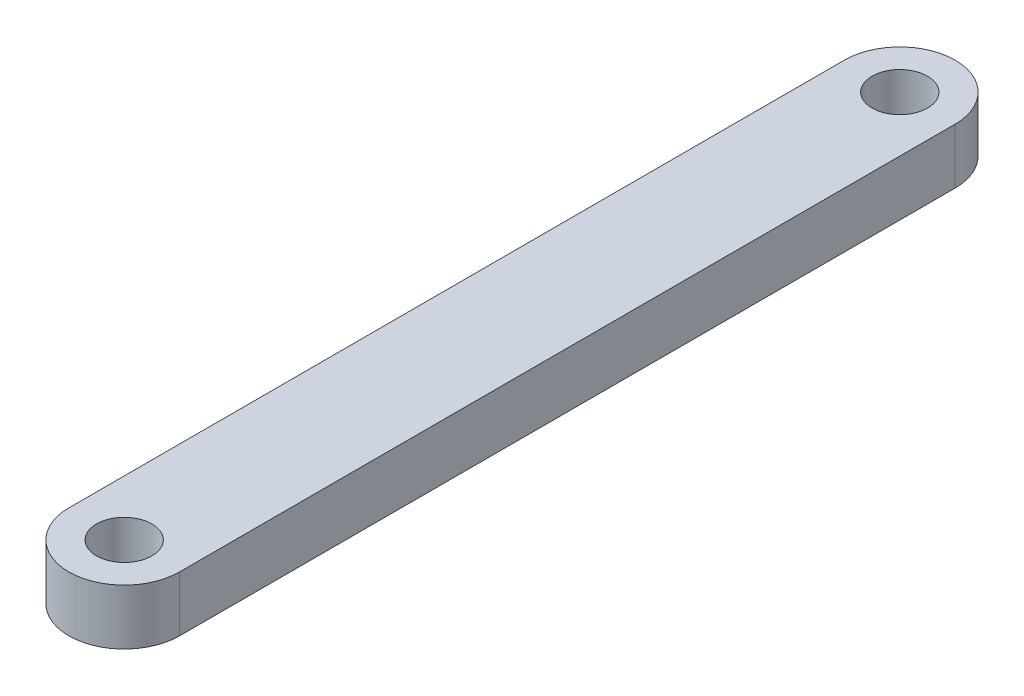
ISO-10303-21;
HEADER;
FILE_DESCRIPTION(('STEP AP214'),'2;1');
FILE_NAME('part.step','',(''),(''),'','','');
FILE_SCHEMA(('AUTOMOTIVE_DESIGN { 1 0 10303 214 1 1 1 1 }'));
ENDSEC;
DATA;
#1=APPLICATION_CONTEXT('core data for automotive mechanical design processes');
#2=APPLICATION_PROTOCOL_DEFINITION('international standard','automotive_design',2000,#1);
#3=PRODUCT_CONTEXT('',#1,'mechanical');
#4=PRODUCT('Part','Part','',(#3));
#5=PRODUCT_RELATED_PRODUCT_CATEGORY('part','',(#4));
#6=PRODUCT_DEFINITION_FORMATION('','',#4);
#7=PRODUCT_DEFINITION_CONTEXT('part definition',#1,'design');
#8=PRODUCT_DEFINITION('design','',#6,#7);
#9=PRODUCT_DEFINITION_SHAPE('','',#8);
#10=(LENGTH_UNIT() NAMED_UNIT(*) SI_UNIT(.MILLI.,.METRE.));
#11=(NAMED_UNIT(*) PLANE_ANGLE_UNIT() SI_UNIT($,.RADIAN.));
#12=(NAMED_UNIT(*) SI_UNIT($,.STERADIAN.) SOLID_ANGLE_UNIT());
#13=UNCERTAINTY_MEASURE_WITH_UNIT(LENGTH_MEASURE(1.E-05),#10,'distance_accuracy_value','');
#14=(GEOMETRIC_REPRESENTATION_CONTEXT(3) GLOBAL_UNCERTAINTY_ASSIGNED_CONTEXT((#13)) GLOBAL_UNIT_ASSIGNED_CONTEXT((#10,
#11,#12)) REPRESENTATION_CONTEXT('',''));
#15=CARTESIAN_POINT('',(0.,0.,0.));
#16=DIRECTION('',(0.,0.,1.));
#17=DIRECTION('',(1.,0.,0.));
#18=AXIS2_PLACEMENT_3D('',#15,#16,#17);
#19=CARTESIAN_POINT('',(0.,5.,-70.));
#20=DIRECTION('',(0.,1.,0.));
#21=DIRECTION('',(0.,0.,1.));
#22=AXIS2_PLACEMENT_3D('',#19,#20,#21);
#23=PLANE('',#22);
#24=CARTESIAN_POINT('',(0.,5.,0.));
#25=DIRECTION('',(0.,1.,0.));
#26=DIRECTION('',(0.,0.,1.));
#27=AXIS2_PLACEMENT_3D('',#24,#25,#26);
#28=CIRCLE('',#27,2.5);
#29=CARTESIAN_POINT('',(0.,5.,2.5));
#30=VERTEX_POINT('',#29);
#31=EDGE_CURVE('E103',#30,#30,#28,.T.);
#32=ORIENTED_EDGE('',*,*,#31,.F.);
#33=EDGE_LOOP('',(#32));
#34=FACE_BOUND('',#33,.T.);
#35=CARTESIAN_POINT('',(0.,5.,-70.));
#36=DIRECTION('',(0.,1.,0.));
#37=DIRECTION('',(0.,0.,1.));
#38=AXIS2_PLACEMENT_3D('',#35,#36,#37);
#39=CIRCLE('',#38,5.);
#40=CARTESIAN_POINT('',(5.,5.,-70.));
#41=VERTEX_POINT('',#40);
#42=CARTESIAN_POINT('',(-5.,5.,-70.));
#43=VERTEX_POINT('',#42);
#44=EDGE_CURVE('E88',#41,#43,#39,.T.);
#45=ORIENTED_EDGE('',*,*,#44,.T.);
#46=DIRECTION('',(0.,0.,1.));
#47=VECTOR('',#46,1.);
#48=CARTESIAN_POINT('',(-5.,5.,-70.));
#49=LINE('',#48,#47);
#50=CARTESIAN_POINT('',(-5.,5.,0.));
#51=VERTEX_POINT('',#50);
#52=EDGE_CURVE('E83',#43,#51,#49,.T.);
#53=ORIENTED_EDGE('',*,*,#52,.T.);
#54=CARTESIAN_POINT('',(0.,5.,0.));
#55=DIRECTION('',(0.,1.,0.));
#56=DIRECTION('',(0.,0.,1.));
#57=AXIS2_PLACEMENT_3D('',#54,#55,#56);
#58=CIRCLE('',#57,5.);
#59=CARTESIAN_POINT('',(5.,5.,0.));
#60=VERTEX_POINT('',#59);
#61=EDGE_CURVE('E86',#51,#60,#58,.T.);
#62=ORIENTED_EDGE('',*,*,#61,.T.);
#63=DIRECTION('',(0.,0.,-1.));
#64=VECTOR('',#63,1.);
#65=CARTESIAN_POINT('',(5.,5.,-70.));
#66=LINE('',#65,#64);
#67=EDGE_CURVE('E53',#60,#41,#66,.T.);
#68=ORIENTED_EDGE('',*,*,#67,.T.);
#69=EDGE_LOOP('',(#45,#53,#62,#68));
#70=FACE_BOUND('',#69,.T.);
#71=CARTESIAN_POINT('',(0.,5.,-70.));
#72=DIRECTION('',(0.,1.,0.));
#73=DIRECTION('',(0.,0.,1.));
#74=AXIS2_PLACEMENT_3D('',#71,#72,#73);
#75=CIRCLE('',#74,2.5);
#76=CARTESIAN_POINT('',(0.,5.,-67.5));
#77=VERTEX_POINT('',#76);
#78=EDGE_CURVE('E118',#77,#77,#75,.T.);
#79=ORIENTED_EDGE('',*,*,#78,.F.);
#80=EDGE_LOOP('',(#79));
#81=FACE_BOUND('',#80,.T.);
#82=ADVANCED_FACE('F36',(#34,#70,#81),#23,.T.);
#83=CARTESIAN_POINT('',(0.,0.,-70.));
#84=DIRECTION('',(0.,1.,0.));
#85=DIRECTION('',(0.,0.,1.));
#86=AXIS2_PLACEMENT_3D('',#83,#84,#85);
#87=PLANE('',#86);
#88=CARTESIAN_POINT('',(0.,0.,-70.));
#89=DIRECTION('',(0.,1.,0.));
#90=DIRECTION('',(0.,0.,1.));
#91=AXIS2_PLACEMENT_3D('',#88,#89,#90);
#92=CIRCLE('',#91,5.);
#93=CARTESIAN_POINT('',(5.,0.,-70.));
#94=VERTEX_POINT('',#93);
#95=CARTESIAN_POINT('',(-5.,0.,-70.));
#96=VERTEX_POINT('',#95);
#97=EDGE_CURVE('E100',#94,#96,#92,.T.);
#98=ORIENTED_EDGE('',*,*,#97,.F.);
#99=DIRECTION('',(0.,0.,-1.));
#100=VECTOR('',#99,1.);
#101=CARTESIAN_POINT('',(5.,0.,-70.));
#102=LINE('',#101,#100);
#103=CARTESIAN_POINT('',(5.,0.,0.));
#104=VERTEX_POINT('',#103);
#105=EDGE_CURVE('E76',#104,#94,#102,.T.);
#106=ORIENTED_EDGE('',*,*,#105,.F.);
#107=CARTESIAN_POINT('',(0.,0.,0.));
#108=DIRECTION('',(0.,1.,0.));
#109=DIRECTION('',(0.,0.,1.));
#110=AXIS2_PLACEMENT_3D('',#107,#108,#109);
#111=CIRCLE('',#110,5.);
#112=CARTESIAN_POINT('',(-5.,0.,0.));
#113=VERTEX_POINT('',#112);
#114=EDGE_CURVE('E70',#113,#104,#111,.T.);
#115=ORIENTED_EDGE('',*,*,#114,.F.);
#116=DIRECTION('',(0.,0.,1.));
#117=VECTOR('',#116,1.);
#118=CARTESIAN_POINT('',(-5.,0.,-70.));
#119=LINE('',#118,#117);
#120=EDGE_CURVE('E92',#96,#113,#119,.T.);
#121=ORIENTED_EDGE('',*,*,#120,.F.);
#122=EDGE_LOOP('',(#98,#106,#115,#121));
#123=FACE_BOUND('',#122,.T.);
#124=CARTESIAN_POINT('',(0.,0.,0.));
#125=DIRECTION('',(0.,1.,0.));
#126=DIRECTION('',(0.,0.,1.));
#127=AXIS2_PLACEMENT_3D('',#124,#125,#126);
#128=CIRCLE('',#127,2.5);
#129=CARTESIAN_POINT('',(0.,0.,2.5));
#130=VERTEX_POINT('',#129);
#131=EDGE_CURVE('E115',#130,#130,#128,.T.);
#132=ORIENTED_EDGE('',*,*,#131,.T.);
#133=EDGE_LOOP('',(#132));
#134=FACE_BOUND('',#133,.T.);
#135=CARTESIAN_POINT('',(0.,0.,-70.));
#136=DIRECTION('',(0.,1.,0.));
#137=DIRECTION('',(0.,0.,1.));
#138=AXIS2_PLACEMENT_3D('',#135,#136,#137);
#139=CIRCLE('',#138,2.5);
#140=CARTESIAN_POINT('',(0.,0.,-67.5));
#141=VERTEX_POINT('',#140);
#142=EDGE_CURVE('E121',#141,#141,#139,.T.);
#143=ORIENTED_EDGE('',*,*,#142,.T.);
#144=EDGE_LOOP('',(#143));
#145=FACE_BOUND('',#144,.T.);
#146=ADVANCED_FACE('F111',(#123,#134,#145),#87,.F.);
#147=CARTESIAN_POINT('',(0.,5.,-70.));
#148=DIRECTION('',(0.,-1.,0.));
#149=DIRECTION('',(0.,0.,-1.));
#150=AXIS2_PLACEMENT_3D('',#147,#148,#149);
#151=CYLINDRICAL_SURFACE('',#150,5.);
#152=ORIENTED_EDGE('',*,*,#97,.T.);
#153=DIRECTION('',(0.,-1.,0.));
#154=VECTOR('',#153,1.);
#155=CARTESIAN_POINT('',(-5.,5.,-70.));
#156=LINE('',#155,#154);
#157=EDGE_CURVE('E11',#43,#96,#156,.T.);
#158=ORIENTED_EDGE('',*,*,#157,.F.);
#159=ORIENTED_EDGE('',*,*,#44,.F.);
#160=DIRECTION('',(0.,-1.,0.));
#161=VECTOR('',#160,1.);
#162=CARTESIAN_POINT('',(5.,5.,-70.));
#163=LINE('',#162,#161);
#164=EDGE_CURVE('E96',#41,#94,#163,.T.);
#165=ORIENTED_EDGE('',*,*,#164,.T.);
#166=EDGE_LOOP('',(#152,#158,#159,#165));
#167=FACE_BOUND('',#166,.T.);
#168=ADVANCED_FACE('F38',(#167),#151,.T.);
#169=CARTESIAN_POINT('',(-5.,5.,-70.));
#170=DIRECTION('',(1.,0.,0.));
#171=DIRECTION('',(0.,0.,-1.));
#172=AXIS2_PLACEMENT_3D('',#169,#170,#171);
#173=PLANE('',#172);
#174=ORIENTED_EDGE('',*,*,#120,.T.);
#175=DIRECTION('',(0.,-1.,0.));
#176=VECTOR('',#175,1.);
#177=CARTESIAN_POINT('',(-5.,5.,0.));
#178=LINE('',#177,#176);
#179=EDGE_CURVE('E45',#51,#113,#178,.T.);
#180=ORIENTED_EDGE('',*,*,#179,.F.);
#181=ORIENTED_EDGE('',*,*,#52,.F.);
#182=ORIENTED_EDGE('',*,*,#157,.T.);
#183=EDGE_LOOP('',(#174,#180,#181,#182));
#184=FACE_BOUND('',#183,.T.);
#185=ADVANCED_FACE('F91',(#184),#173,.F.);
#186=CARTESIAN_POINT('',(0.,5.,0.));
#187=DIRECTION('',(0.,-1.,0.));
#188=DIRECTION('',(0.,0.,-1.));
#189=AXIS2_PLACEMENT_3D('',#186,#187,#188);
#190=CYLINDRICAL_SURFACE('',#189,5.);
#191=ORIENTED_EDGE('',*,*,#114,.T.);
#192=DIRECTION('',(0.,-1.,0.));
#193=VECTOR('',#192,1.);
#194=CARTESIAN_POINT('',(5.,5.,0.));
#195=LINE('',#194,#193);
#196=EDGE_CURVE('E93',#60,#104,#195,.T.);
#197=ORIENTED_EDGE('',*,*,#196,.F.);
#198=ORIENTED_EDGE('',*,*,#61,.F.);
#199=ORIENTED_EDGE('',*,*,#179,.T.);
#200=EDGE_LOOP('',(#191,#197,#198,#199));
#201=FACE_BOUND('',#200,.T.);
#202=ADVANCED_FACE('F94',(#201),#190,.T.);
#203=CARTESIAN_POINT('',(5.,5.,-70.));
#204=DIRECTION('',(-1.,0.,0.));
#205=DIRECTION('',(0.,0.,1.));
#206=AXIS2_PLACEMENT_3D('',#203,#204,#205);
#207=PLANE('',#206);
#208=ORIENTED_EDGE('',*,*,#105,.T.);
#209=ORIENTED_EDGE('',*,*,#164,.F.);
#210=ORIENTED_EDGE('',*,*,#67,.F.);
#211=ORIENTED_EDGE('',*,*,#196,.T.);
#212=EDGE_LOOP('',(#208,#209,#210,#211));
#213=FACE_BOUND('',#212,.T.);
#214=ADVANCED_FACE('F108',(#213),#207,.F.);
#215=CARTESIAN_POINT('',(0.,5.,0.));
#216=DIRECTION('',(0.,-1.,0.));
#217=DIRECTION('',(0.,0.,-1.));
#218=AXIS2_PLACEMENT_3D('',#215,#216,#217);
#219=CYLINDRICAL_SURFACE('',#218,2.5);
#220=ORIENTED_EDGE('',*,*,#31,.T.);
#221=EDGE_LOOP('',(#220));
#222=FACE_BOUND('',#221,.T.);
#223=ORIENTED_EDGE('',*,*,#131,.F.);
#224=EDGE_LOOP('',(#223));
#225=FACE_BOUND('',#224,.T.);
#226=ADVANCED_FACE('F138',(#222,#225),#219,.F.);
#227=CARTESIAN_POINT('',(0.,5.,-70.));
#228=DIRECTION('',(0.,-1.,0.));
#229=DIRECTION('',(0.,0.,-1.));
#230=AXIS2_PLACEMENT_3D('',#227,#228,#229);
#231=CYLINDRICAL_SURFACE('',#230,2.5);
#232=ORIENTED_EDGE('',*,*,#78,.T.);
#233=EDGE_LOOP('',(#232));
#234=FACE_BOUND('',#233,.T.);
#235=ORIENTED_EDGE('',*,*,#142,.F.);
#236=EDGE_LOOP('',(#235));
#237=FACE_BOUND('',#236,.T.);
#238=ADVANCED_FACE('F127',(#234,#237),#231,.F.);
#239=CLOSED_SHELL('',(#82,#146,#168,#185,#202,#214,#226,#238));
#240=MANIFOLD_SOLID_BREP('B2',#239);
#241=ADVANCED_BREP_SHAPE_REPRESENTATION('',(#18,#240),#14);
#242=SHAPE_DEFINITION_REPRESENTATION(#9,#241);
ENDSEC;
END-ISO-10303-21;
